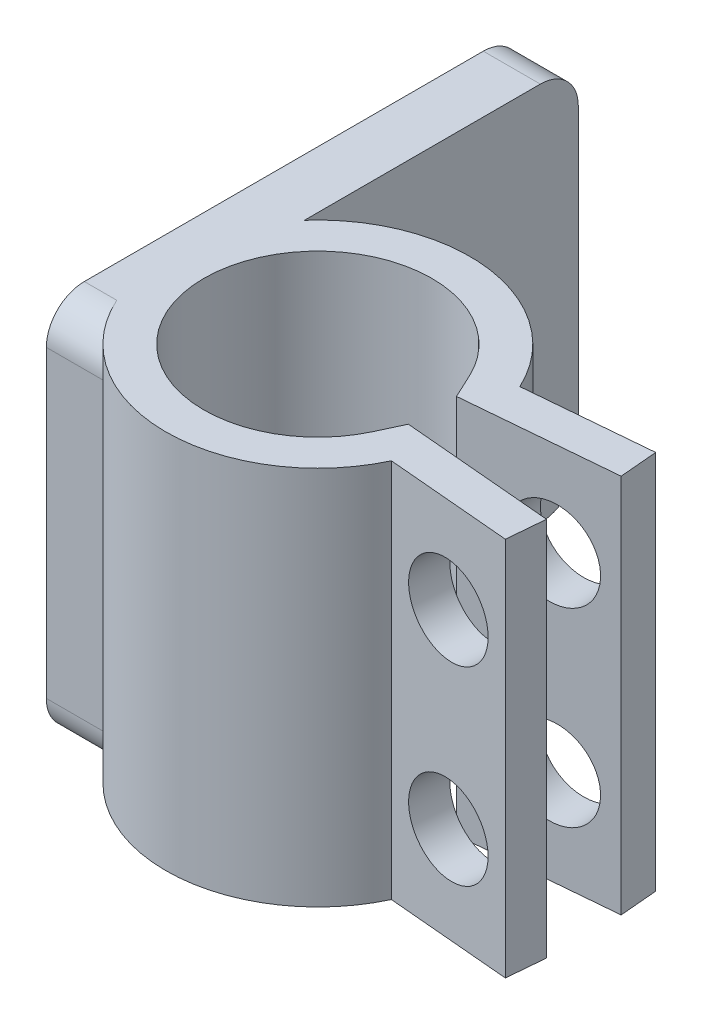
ISO-10303-21;
HEADER;
FILE_DESCRIPTION(('STEP AP214'),'2;1');
FILE_NAME('part.step','',(''),(''),'','','');
FILE_SCHEMA(('AUTOMOTIVE_DESIGN { 1 0 10303 214 1 1 1 1 }'));
ENDSEC;
DATA;
#1=APPLICATION_CONTEXT('core data for automotive mechanical design processes');
#2=APPLICATION_PROTOCOL_DEFINITION('international standard','automotive_design',2000,#1);
#3=PRODUCT_CONTEXT('',#1,'mechanical');
#4=PRODUCT('Part','Part','',(#3));
#5=PRODUCT_RELATED_PRODUCT_CATEGORY('part','',(#4));
#6=PRODUCT_DEFINITION_FORMATION('','',#4);
#7=PRODUCT_DEFINITION_CONTEXT('part definition',#1,'design');
#8=PRODUCT_DEFINITION('design','',#6,#7);
#9=PRODUCT_DEFINITION_SHAPE('','',#8);
#10=(LENGTH_UNIT() NAMED_UNIT(*) SI_UNIT(.MILLI.,.METRE.));
#11=(NAMED_UNIT(*) PLANE_ANGLE_UNIT() SI_UNIT($,.RADIAN.));
#12=(NAMED_UNIT(*) SI_UNIT($,.STERADIAN.) SOLID_ANGLE_UNIT());
#13=UNCERTAINTY_MEASURE_WITH_UNIT(LENGTH_MEASURE(1.E-05),#10,'distance_accuracy_value','');
#14=(GEOMETRIC_REPRESENTATION_CONTEXT(3) GLOBAL_UNCERTAINTY_ASSIGNED_CONTEXT((#13)) GLOBAL_UNIT_ASSIGNED_CONTEXT((#10,
#11,#12)) REPRESENTATION_CONTEXT('',''));
#15=CARTESIAN_POINT('',(0.,0.,0.));
#16=DIRECTION('',(0.,0.,1.));
#17=DIRECTION('',(1.,0.,0.));
#18=AXIS2_PLACEMENT_3D('',#15,#16,#17);
#19=CARTESIAN_POINT('',(3.81,25.4,0.));
#20=DIRECTION('',(0.,0.,-1.));
#21=DIRECTION('',(-1.,0.,0.));
#22=AXIS2_PLACEMENT_3D('',#19,#20,#21);
#23=PLANE('',#22);
#24=DIRECTION('',(0.,-1.,0.));
#25=VECTOR('',#24,1.);
#26=CARTESIAN_POINT('',(3.80999999999999,25.4,0.));
#27=LINE('',#26,#25);
#28=CARTESIAN_POINT('',(3.80999999999999,22.86,0.));
#29=VERTEX_POINT('',#28);
#30=CARTESIAN_POINT('',(3.80999999999999,2.54,0.));
#31=VERTEX_POINT('',#30);
#32=EDGE_CURVE('E200',#29,#31,#27,.T.);
#33=ORIENTED_EDGE('',*,*,#32,.F.);
#34=DIRECTION('',(1.,0.,0.));
#35=VECTOR('',#34,1.);
#36=CARTESIAN_POINT('',(3.81,22.86,0.));
#37=LINE('',#36,#35);
#38=CARTESIAN_POINT('',(0.,22.86,0.));
#39=VERTEX_POINT('',#38);
#40=EDGE_CURVE('E371',#29,#39,#37,.F.);
#41=ORIENTED_EDGE('',*,*,#40,.T.);
#42=DIRECTION('',(0.,-1.,0.));
#43=VECTOR('',#42,1.);
#44=CARTESIAN_POINT('',(0.,25.4,0.));
#45=LINE('',#44,#43);
#46=CARTESIAN_POINT('',(0.,2.54,0.));
#47=VERTEX_POINT('',#46);
#48=EDGE_CURVE('E243',#39,#47,#45,.T.);
#49=ORIENTED_EDGE('',*,*,#48,.T.);
#50=DIRECTION('',(1.,0.,0.));
#51=VECTOR('',#50,1.);
#52=CARTESIAN_POINT('',(3.80999999999999,2.54,0.));
#53=LINE('',#52,#51);
#54=EDGE_CURVE('E368',#47,#31,#53,.T.);
#55=ORIENTED_EDGE('',*,*,#54,.T.);
#56=EDGE_LOOP('',(#33,#41,#49,#55));
#57=FACE_BOUND('',#56,.T.);
#58=ADVANCED_FACE('F45',(#57),#23,.F.);
#59=CARTESIAN_POINT('',(11.43,25.4,-6.72020833010407));
#60=DIRECTION('',(0.,-1.,0.));
#61=DIRECTION('',(0.,0.,-1.));
#62=AXIS2_PLACEMENT_3D('',#59,#60,#61);
#63=CYLINDRICAL_SURFACE('',#62,10.16);
#64=CARTESIAN_POINT('',(11.43,0.,-6.72020833010407));
#65=DIRECTION('',(0.,1.,0.));
#66=DIRECTION('',(0.,0.,-1.));
#67=AXIS2_PLACEMENT_3D('',#64,#65,#66);
#68=CIRCLE('',#67,10.16);
#69=CARTESIAN_POINT('',(2.16979166989591,0.,-2.54));
#70=VERTEX_POINT('',#69);
#71=CARTESIAN_POINT('',(20.6380871162924,0.,-2.42640679081854));
#72=VERTEX_POINT('',#71);
#73=EDGE_CURVE('E66',#70,#72,#68,.T.);
#74=ORIENTED_EDGE('',*,*,#73,.T.);
#75=DIRECTION('',(0.,-1.,0.));
#76=VECTOR('',#75,1.);
#77=CARTESIAN_POINT('',(20.6380871162924,25.4,-2.42640679081854));
#78=LINE('',#77,#76);
#79=CARTESIAN_POINT('',(20.6380871162924,25.4,-2.42640679081854));
#80=VERTEX_POINT('',#79);
#81=EDGE_CURVE('E196',#80,#72,#78,.T.);
#82=ORIENTED_EDGE('',*,*,#81,.F.);
#83=CARTESIAN_POINT('',(11.43,25.4,-6.72020833010407));
#84=DIRECTION('',(0.,1.,0.));
#85=DIRECTION('',(0.,0.,-1.));
#86=AXIS2_PLACEMENT_3D('',#83,#84,#85);
#87=CIRCLE('',#86,10.16);
#88=CARTESIAN_POINT('',(2.16979166989591,25.4,-2.54));
#89=VERTEX_POINT('',#88);
#90=EDGE_CURVE('E180',#89,#80,#87,.T.);
#91=ORIENTED_EDGE('',*,*,#90,.F.);
#92=CARTESIAN_POINT('',(2.16979166989591,25.4,-2.54));
#93=CARTESIAN_POINT('',(2.20617578446925,25.4000022486676,-2.45937381307713));
#94=CARTESIAN_POINT('',(2.24362102791045,25.39616176463,-2.37925640768245));
#95=CARTESIAN_POINT('',(2.32027563615628,25.3810992971566,-2.22062843644151));
#96=CARTESIAN_POINT('',(2.35948395849282,25.3698816235803,-2.14211695998561));
#97=CARTESIAN_POINT('',(2.43922284391043,25.3404149766029,-1.98744109188222));
#98=CARTESIAN_POINT('',(2.47974880513843,25.3221884790528,-1.91127002969529));
#99=CARTESIAN_POINT('',(2.56186735924763,25.2790005467206,-1.76146535549955));
#100=CARTESIAN_POINT('',(2.6034601119886,25.2540380971501,-1.68783212770848));
#101=CARTESIAN_POINT('',(2.72906700992553,25.1695859814455,-1.47168505024253));
#102=CARTESIAN_POINT('',(2.81415714228701,25.100438463565,-1.33344794231537));
#103=CARTESIAN_POINT('',(2.98384054470034,24.9379336121309,-1.07109642517883));
#104=CARTESIAN_POINT('',(3.06843224509921,24.8445215889568,-0.947014842158039));
#105=CARTESIAN_POINT('',(3.19370014114968,24.6844263356683,-0.770875672298314));
#106=CARTESIAN_POINT('',(3.23621993407571,24.6260041784557,-0.712514926105099));
#107=CARTESIAN_POINT('',(3.31908837111386,24.5029120426174,-0.601095528766416));
#108=CARTESIAN_POINT('',(3.35943655513979,24.4382407480728,-0.548037999157822));
#109=CARTESIAN_POINT('',(3.4757110599449,24.2352989960347,-0.397965544116279));
#110=CARTESIAN_POINT('',(3.54723992219447,24.0876413639235,-0.309537276156607));
#111=CARTESIAN_POINT('',(3.64733112517624,23.8274669513059,-0.188784370342516));
#112=CARTESIAN_POINT('',(3.68210610695862,23.7213107872541,-0.147709658422272));
#113=CARTESIAN_POINT('',(3.74028760162198,23.5017117261741,-0.0797318652234852));
#114=CARTESIAN_POINT('',(3.76372533504968,23.3882898256055,-0.0527898477916273));
#115=CARTESIAN_POINT('',(3.79011263506569,23.2049960098705,-0.0226011391847973));
#116=CARTESIAN_POINT('',(3.7975279205162,23.1365700514542,-0.0141613715277852));
#117=CARTESIAN_POINT('',(3.80748887611146,22.9987814828586,-0.00284710306384829));
#118=CARTESIAN_POINT('',(3.81002535650179,22.9294173524163,1.6895304640736E-05));
#119=CARTESIAN_POINT('',(3.80999999999997,22.86,0.));
#120=B_SPLINE_CURVE_WITH_KNOTS('',3,(#92,#93,#94,#95,#96,#97,#98,#99,#100,#101,#102,#103,#104,
#105,#106,#107,#108,#109,#110,#111,#112,#113,#114,#115,#116,#117,#118,#119),.UNSPECIFIED.,.F.,
.F.,(4,2,2,2,2,2,2,2,2,2,2,2,2,4),(0.,0.265235178077459,0.530315539461783,0.794552837813953,
1.05882996643843,1.58577059684386,2.11390935939937,2.39219724894735,2.670543867508,
3.22492127293216,3.58070086763114,3.93549505749906,4.14315412551022,4.35120396014529),.UNSPECIFIED.);
#121=EDGE_CURVE('E59',#89,#29,#120,.T.);
#122=ORIENTED_EDGE('',*,*,#121,.T.);
#123=ORIENTED_EDGE('',*,*,#32,.T.);
#124=CARTESIAN_POINT('',(3.80999999999999,2.54,0.));
#125=CARTESIAN_POINT('',(3.81001944877823,2.47953872180205,1.45912342866978E-05));
#126=CARTESIAN_POINT('',(3.80809672355019,2.41909078166757,-0.00215825276973638));
#127=CARTESIAN_POINT('',(3.80051585879497,2.29878731189161,-0.0107649012316474));
#128=CARTESIAN_POINT('',(3.79486105454885,2.23893130168792,-0.0171949011744631));
#129=CARTESIAN_POINT('',(3.78003058297259,2.12079426141355,-0.0341268494232981));
#130=CARTESIAN_POINT('',(3.77088660941287,2.06250396789028,-0.0445921519081007));
#131=CARTESIAN_POINT('',(3.74933587454819,1.9473779122334,-0.0693986645282128));
#132=CARTESIAN_POINT('',(3.73692854199819,1.89054240667103,-0.0837405532650684));
#133=CARTESIAN_POINT('',(3.69535326468878,1.72315302604248,-0.132139732832964));
#134=CARTESIAN_POINT('',(3.66176421622409,1.61520883278615,-0.171646022371034));
#135=CARTESIAN_POINT('',(3.58542459748406,1.40814805402263,-0.263289991518458));
#136=CARTESIAN_POINT('',(3.54264981823027,1.30905579431727,-0.315461097559224));
#137=CARTESIAN_POINT('',(3.43288454202392,1.08469635860234,-0.452666275131953));
#138=CARTESIAN_POINT('',(3.36288823373286,0.963906239680729,-0.542638728252105));
#139=CARTESIAN_POINT('',(3.21580363904479,0.742168228790588,-0.739595264895516));
#140=CARTESIAN_POINT('',(3.1387062673135,0.641246289347291,-0.846601272773882));
#141=CARTESIAN_POINT('',(2.98054541131174,0.458795659041022,-1.07644811638925));
#142=CARTESIAN_POINT('',(2.89944272053735,0.377543847518989,-1.19948127203536));
#143=CARTESIAN_POINT('',(2.7377594895234,0.23742890417796,-1.45772453437343));
#144=CARTESIAN_POINT('',(2.65717839555736,0.178535941222118,-1.59291811645708));
#145=CARTESIAN_POINT('',(2.50623938680048,0.0887854917835852,-1.86082818487476));
#146=CARTESIAN_POINT('',(2.43560749693108,0.0559096808611599,-1.99270691167154));
#147=CARTESIAN_POINT('',(2.33310298418178,0.0226124715089665,-2.19496576323919));
#148=CARTESIAN_POINT('',(2.29947112023319,0.014182367344856,-2.26320852405464));
#149=CARTESIAN_POINT('',(2.23356266209511,0.00287570379854424,-2.40083592036335));
#150=CARTESIAN_POINT('',(2.20128669360069,1.68138951055278E-06,-2.47022106290563));
#151=CARTESIAN_POINT('',(2.16979166989591,0.,-2.54));
#152=B_SPLINE_CURVE_WITH_KNOTS('',3,(#124,#125,#126,#127,#128,#129,#130,#131,#132,#133,#134,
#135,#136,#137,#138,#139,#140,#141,#142,#143,#144,#145,#146,#147,#148,#149,#150,#151),
.UNSPECIFIED.,.F.,.F.,(4,2,2,2,2,2,2,2,2,2,2,2,2,4),(0.,0.181292603993164,0.362423409562659,
0.541946643901701,0.721501324395022,1.07907849454729,1.43760988491519,1.93321554558637,
2.42946435012614,2.93233791696081,3.43453817299674,3.89233791589334,4.12177898291297,
4.35132479073711),.UNSPECIFIED.);
#153=EDGE_CURVE('E11',#31,#70,#152,.T.);
#154=ORIENTED_EDGE('',*,*,#153,.T.);
#155=EDGE_LOOP('',(#74,#82,#91,#122,#123,#154));
#156=FACE_BOUND('',#155,.T.);
#157=ADVANCED_FACE('F197',(#156),#63,.T.);
#158=CARTESIAN_POINT('',(28.9876659345984,25.4,-1.69591329900057));
#159=DIRECTION('',(0.0871557427476594,0.,-0.996194698091745));
#160=DIRECTION('',(-0.996194698091745,0.,-0.0871557427476594));
#161=AXIS2_PLACEMENT_3D('',#158,#159,#160);
#162=PLANE('',#161);
#163=CARTESIAN_POINT('',(24.8128765254454,19.05,-2.06116004490956));
#164=DIRECTION('',(-0.0871557427476594,0.,0.996194698091746));
#165=DIRECTION('',(0.996194698091746,0.,0.0871557427476594));
#166=AXIS2_PLACEMENT_3D('',#163,#164,#165);
#167=CIRCLE('',#166,2.921);
#168=CARTESIAN_POINT('',(27.7227612385714,19.05,-1.80657812034365));
#169=VERTEX_POINT('',#168);
#170=EDGE_CURVE('E536',#169,#169,#167,.T.);
#171=ORIENTED_EDGE('',*,*,#170,.F.);
#172=EDGE_LOOP('',(#171));
#173=FACE_BOUND('',#172,.T.);
#174=CARTESIAN_POINT('',(24.8128765254454,6.35,-2.06116004490956));
#175=DIRECTION('',(-0.0871557427476594,0.,0.996194698091746));
#176=DIRECTION('',(0.996194698091746,0.,0.0871557427476594));
#177=AXIS2_PLACEMENT_3D('',#174,#175,#176);
#178=CIRCLE('',#177,2.921);
#179=CARTESIAN_POINT('',(27.7227612385714,6.35,-1.80657812034365));
#180=VERTEX_POINT('',#179);
#181=EDGE_CURVE('E548',#180,#180,#178,.T.);
#182=ORIENTED_EDGE('',*,*,#181,.F.);
#183=EDGE_LOOP('',(#182));
#184=FACE_BOUND('',#183,.T.);
#185=DIRECTION('',(0.996194698091745,0.,0.0871557427476594));
#186=VECTOR('',#185,1.);
#187=CARTESIAN_POINT('',(28.9876659345984,0.,-1.69591329900057));
#188=LINE('',#187,#186);
#189=CARTESIAN_POINT('',(28.9876659345984,0.,-1.69591329900057));
#190=VERTEX_POINT('',#189);
#191=EDGE_CURVE('E246',#72,#190,#188,.T.);
#192=ORIENTED_EDGE('',*,*,#191,.T.);
#193=DIRECTION('',(0.,-1.,0.));
#194=VECTOR('',#193,1.);
#195=CARTESIAN_POINT('',(28.9876659345984,25.4,-1.69591329900057));
#196=LINE('',#195,#194);
#197=CARTESIAN_POINT('',(28.9876659345984,25.4,-1.69591329900057));
#198=VERTEX_POINT('',#197);
#199=EDGE_CURVE('E201',#198,#190,#196,.T.);
#200=ORIENTED_EDGE('',*,*,#199,.F.);
#201=DIRECTION('',(0.996194698091745,0.,0.0871557427476594));
#202=VECTOR('',#201,1.);
#203=CARTESIAN_POINT('',(28.9876659345984,25.4,-1.69591329900057));
#204=LINE('',#203,#202);
#205=EDGE_CURVE('E185',#80,#198,#204,.T.);
#206=ORIENTED_EDGE('',*,*,#205,.F.);
#207=ORIENTED_EDGE('',*,*,#81,.T.);
#208=EDGE_LOOP('',(#192,#200,#206,#207));
#209=FACE_BOUND('',#208,.T.);
#210=ADVANCED_FACE('F203',(#173,#184,#209),#162,.F.);
#211=CARTESIAN_POINT('',(29.2090415211774,25.4,-4.22624783215361));
#212=DIRECTION('',(-0.996194698091745,0.,-0.0871557427476597));
#213=DIRECTION('',(-0.0871557427476597,0.,0.996194698091745));
#214=AXIS2_PLACEMENT_3D('',#211,#212,#213);
#215=PLANE('',#214);
#216=DIRECTION('',(0.0871557427476596,0.,-0.996194698091745));
#217=VECTOR('',#216,1.);
#218=CARTESIAN_POINT('',(29.2090415211774,0.,-4.22624783215361));
#219=LINE('',#218,#217);
#220=CARTESIAN_POINT('',(29.2090415211774,0.,-4.22624783215361));
#221=VERTEX_POINT('',#220);
#222=EDGE_CURVE('E250',#190,#221,#219,.T.);
#223=ORIENTED_EDGE('',*,*,#222,.T.);
#224=DIRECTION('',(0.,-1.,0.));
#225=VECTOR('',#224,1.);
#226=CARTESIAN_POINT('',(29.2090415211774,25.4,-4.22624783215361));
#227=LINE('',#226,#225);
#228=CARTESIAN_POINT('',(29.2090415211774,25.4,-4.22624783215361));
#229=VERTEX_POINT('',#228);
#230=EDGE_CURVE('E328',#229,#221,#227,.T.);
#231=ORIENTED_EDGE('',*,*,#230,.F.);
#232=DIRECTION('',(0.0871557427476596,0.,-0.996194698091745));
#233=VECTOR('',#232,1.);
#234=CARTESIAN_POINT('',(29.2090415211774,25.4,-4.22624783215361));
#235=LINE('',#234,#233);
#236=EDGE_CURVE('E207',#198,#229,#235,.T.);
#237=ORIENTED_EDGE('',*,*,#236,.F.);
#238=ORIENTED_EDGE('',*,*,#199,.T.);
#239=EDGE_LOOP('',(#223,#231,#237,#238));
#240=FACE_BOUND('',#239,.T.);
#241=ADVANCED_FACE('F475',(#240),#215,.F.);
#242=CARTESIAN_POINT('',(19.0877033885653,25.4,-5.11175017846983));
#243=DIRECTION('',(-0.0871557427476601,0.,0.996194698091745));
#244=DIRECTION('',(0.996194698091745,0.,0.0871557427476601));
#245=AXIS2_PLACEMENT_3D('',#242,#243,#244);
#246=PLANE('',#245);
#247=CARTESIAN_POINT('',(25.0342521120244,19.05,-4.5914945780626));
#248=DIRECTION('',(-0.0871557427476601,0.,0.996194698091745));
#249=DIRECTION('',(0.996194698091745,0.,0.0871557427476601));
#250=AXIS2_PLACEMENT_3D('',#247,#248,#249);
#251=CIRCLE('',#250,2.921);
#252=CARTESIAN_POINT('',(27.9441368251504,19.05,-4.33691265349668));
#253=VERTEX_POINT('',#252);
#254=EDGE_CURVE('E539',#253,#253,#251,.F.);
#255=ORIENTED_EDGE('',*,*,#254,.F.);
#256=EDGE_LOOP('',(#255));
#257=FACE_BOUND('',#256,.T.);
#258=CARTESIAN_POINT('',(25.0342521120244,6.35,-4.5914945780626));
#259=DIRECTION('',(-0.0871557427476601,0.,0.996194698091745));
#260=DIRECTION('',(0.996194698091745,0.,0.0871557427476601));
#261=AXIS2_PLACEMENT_3D('',#258,#259,#260);
#262=CIRCLE('',#261,2.921);
#263=CARTESIAN_POINT('',(27.9441368251504,6.35,-4.33691265349668));
#264=VERTEX_POINT('',#263);
#265=EDGE_CURVE('E554',#264,#264,#262,.F.);
#266=ORIENTED_EDGE('',*,*,#265,.F.);
#267=EDGE_LOOP('',(#266));
#268=FACE_BOUND('',#267,.T.);
#269=DIRECTION('',(-0.996194698091745,0.,-0.0871557427476601));
#270=VECTOR('',#269,1.);
#271=CARTESIAN_POINT('',(19.0877033885653,0.,-5.11175017846983));
#272=LINE('',#271,#270);
#273=CARTESIAN_POINT('',(19.0877033885653,0.,-5.11175017846983));
#274=VERTEX_POINT('',#273);
#275=EDGE_CURVE('E253',#221,#274,#272,.T.);
#276=ORIENTED_EDGE('',*,*,#275,.T.);
#277=DIRECTION('',(0.,-1.,0.));
#278=VECTOR('',#277,1.);
#279=CARTESIAN_POINT('',(19.0877033885653,25.4,-5.11175017846983));
#280=LINE('',#279,#278);
#281=CARTESIAN_POINT('',(19.0877033885653,25.4,-5.11175017846983));
#282=VERTEX_POINT('',#281);
#283=EDGE_CURVE('E324',#282,#274,#280,.T.);
#284=ORIENTED_EDGE('',*,*,#283,.F.);
#285=DIRECTION('',(-0.996194698091745,0.,-0.0871557427476601));
#286=VECTOR('',#285,1.);
#287=CARTESIAN_POINT('',(19.0877033885653,25.4,-5.11175017846983));
#288=LINE('',#287,#286);
#289=EDGE_CURVE('E210',#229,#282,#288,.T.);
#290=ORIENTED_EDGE('',*,*,#289,.F.);
#291=ORIENTED_EDGE('',*,*,#230,.T.);
#292=EDGE_LOOP('',(#276,#284,#290,#291));
#293=FACE_BOUND('',#292,.T.);
#294=ADVANCED_FACE('F471',(#257,#268,#293),#246,.F.);
#295=CARTESIAN_POINT('',(18.3360653372192,25.4,-3.49985717563994));
#296=DIRECTION('',(0.906307787036651,0.,0.422618261740698));
#297=DIRECTION('',(0.422618261740698,0.,-0.906307787036651));
#298=AXIS2_PLACEMENT_3D('',#295,#296,#297);
#299=PLANE('',#298);
#300=DIRECTION('',(-0.422618261740698,0.,0.906307787036651));
#301=VECTOR('',#300,1.);
#302=CARTESIAN_POINT('',(18.3360653372192,0.,-3.49985717563994));
#303=LINE('',#302,#301);
#304=CARTESIAN_POINT('',(18.3360653372192,0.,-3.49985717563994));
#305=VERTEX_POINT('',#304);
#306=EDGE_CURVE('E256',#274,#305,#303,.T.);
#307=ORIENTED_EDGE('',*,*,#306,.T.);
#308=DIRECTION('',(0.,-1.,0.));
#309=VECTOR('',#308,1.);
#310=CARTESIAN_POINT('',(18.3360653372192,25.4,-3.49985717563994));
#311=LINE('',#310,#309);
#312=CARTESIAN_POINT('',(18.3360653372192,25.4,-3.49985717563994));
#313=VERTEX_POINT('',#312);
#314=EDGE_CURVE('E320',#313,#305,#311,.T.);
#315=ORIENTED_EDGE('',*,*,#314,.F.);
#316=DIRECTION('',(-0.422618261740698,0.,0.906307787036651));
#317=VECTOR('',#316,1.);
#318=CARTESIAN_POINT('',(18.3360653372192,25.4,-3.49985717563994));
#319=LINE('',#318,#317);
#320=EDGE_CURVE('E216',#282,#313,#319,.T.);
#321=ORIENTED_EDGE('',*,*,#320,.F.);
#322=ORIENTED_EDGE('',*,*,#283,.T.);
#323=EDGE_LOOP('',(#307,#315,#321,#322));
#324=FACE_BOUND('',#323,.T.);
#325=ADVANCED_FACE('F466',(#324),#299,.F.);
#326=CARTESIAN_POINT('',(11.43,25.4,-6.72020833010407));
#327=DIRECTION('',(0.,-1.,0.));
#328=DIRECTION('',(0.,0.,-1.));
#329=AXIS2_PLACEMENT_3D('',#326,#327,#328);
#330=CYLINDRICAL_SURFACE('',#329,7.62);
#331=CARTESIAN_POINT('',(11.43,0.,-6.72020833010407));
#332=DIRECTION('',(0.,-1.,0.));
#333=DIRECTION('',(0.,0.,-1.));
#334=AXIS2_PLACEMENT_3D('',#331,#332,#333);
#335=CIRCLE('',#334,7.62);
#336=CARTESIAN_POINT('',(18.3360653372193,0.,-9.9405594845682));
#337=VERTEX_POINT('',#336);
#338=EDGE_CURVE('E260',#305,#337,#335,.T.);
#339=ORIENTED_EDGE('',*,*,#338,.T.);
#340=DIRECTION('',(0.,-1.,0.));
#341=VECTOR('',#340,1.);
#342=CARTESIAN_POINT('',(18.3360653372193,25.4,-9.9405594845682));
#343=LINE('',#342,#341);
#344=CARTESIAN_POINT('',(18.3360653372193,25.4,-9.9405594845682));
#345=VERTEX_POINT('',#344);
#346=EDGE_CURVE('E316',#345,#337,#343,.T.);
#347=ORIENTED_EDGE('',*,*,#346,.F.);
#348=CARTESIAN_POINT('',(11.43,25.4,-6.72020833010407));
#349=DIRECTION('',(0.,-1.,0.));
#350=DIRECTION('',(0.,0.,-1.));
#351=AXIS2_PLACEMENT_3D('',#348,#349,#350);
#352=CIRCLE('',#351,7.61999999999999);
#353=EDGE_CURVE('E219',#313,#345,#352,.T.);
#354=ORIENTED_EDGE('',*,*,#353,.F.);
#355=ORIENTED_EDGE('',*,*,#314,.T.);
#356=EDGE_LOOP('',(#339,#347,#354,#355));
#357=FACE_BOUND('',#356,.T.);
#358=ADVANCED_FACE('F462',(#357),#330,.F.);
#359=CARTESIAN_POINT('',(18.3360653372193,25.4,-9.9405594845682));
#360=DIRECTION('',(0.90630778703665,0.,-0.4226182617407));
#361=DIRECTION('',(-0.4226182617407,0.,-0.90630778703665));
#362=AXIS2_PLACEMENT_3D('',#359,#360,#361);
#363=PLANE('',#362);
#364=DIRECTION('',(0.4226182617407,0.,0.90630778703665));
#365=VECTOR('',#364,1.);
#366=CARTESIAN_POINT('',(18.3360653372193,0.,-9.9405594845682));
#367=LINE('',#366,#365);
#368=CARTESIAN_POINT('',(19.0877033885653,0.,-8.3286664817383));
#369=VERTEX_POINT('',#368);
#370=EDGE_CURVE('E263',#337,#369,#367,.T.);
#371=ORIENTED_EDGE('',*,*,#370,.T.);
#372=DIRECTION('',(0.,-1.,0.));
#373=VECTOR('',#372,1.);
#374=CARTESIAN_POINT('',(19.0877033885653,25.4,-8.3286664817383));
#375=LINE('',#374,#373);
#376=CARTESIAN_POINT('',(19.0877033885653,25.4,-8.3286664817383));
#377=VERTEX_POINT('',#376);
#378=EDGE_CURVE('E312',#377,#369,#375,.T.);
#379=ORIENTED_EDGE('',*,*,#378,.F.);
#380=DIRECTION('',(0.4226182617407,0.,0.90630778703665));
#381=VECTOR('',#380,1.);
#382=CARTESIAN_POINT('',(18.3360653372193,25.4,-9.9405594845682));
#383=LINE('',#382,#381);
#384=EDGE_CURVE('E222',#345,#377,#383,.T.);
#385=ORIENTED_EDGE('',*,*,#384,.F.);
#386=ORIENTED_EDGE('',*,*,#346,.T.);
#387=EDGE_LOOP('',(#371,#379,#385,#386));
#388=FACE_BOUND('',#387,.T.);
#389=ADVANCED_FACE('F457',(#388),#363,.F.);
#390=CARTESIAN_POINT('',(19.0877033885653,25.4,-8.3286664817383));
#391=DIRECTION('',(-0.087155742747663,0.,-0.996194698091745));
#392=DIRECTION('',(-0.996194698091745,0.,0.087155742747663));
#393=AXIS2_PLACEMENT_3D('',#390,#391,#392);
#394=PLANE('',#393);
#395=CARTESIAN_POINT('',(25.0342521120244,19.05,-8.84892208214556));
#396=DIRECTION('',(-0.087155742747663,0.,-0.996194698091745));
#397=DIRECTION('',(-0.996194698091745,0.,0.087155742747663));
#398=AXIS2_PLACEMENT_3D('',#395,#396,#397);
#399=CIRCLE('',#398,2.921);
#400=CARTESIAN_POINT('',(22.1243673988984,19.05,-8.59434015757964));
#401=VERTEX_POINT('',#400);
#402=EDGE_CURVE('E558',#401,#401,#399,.F.);
#403=ORIENTED_EDGE('',*,*,#402,.F.);
#404=EDGE_LOOP('',(#403));
#405=FACE_BOUND('',#404,.T.);
#406=CARTESIAN_POINT('',(25.0342521120244,6.35,-8.84892208214556));
#407=DIRECTION('',(-0.087155742747663,0.,-0.996194698091745));
#408=DIRECTION('',(-0.996194698091745,0.,0.087155742747663));
#409=AXIS2_PLACEMENT_3D('',#406,#407,#408);
#410=CIRCLE('',#409,2.921);
#411=CARTESIAN_POINT('',(22.1243673988984,6.35,-8.59434015757964));
#412=VERTEX_POINT('',#411);
#413=EDGE_CURVE('E546',#412,#412,#410,.F.);
#414=ORIENTED_EDGE('',*,*,#413,.F.);
#415=EDGE_LOOP('',(#414));
#416=FACE_BOUND('',#415,.T.);
#417=DIRECTION('',(0.996194698091745,0.,-0.087155742747663));
#418=VECTOR('',#417,1.);
#419=CARTESIAN_POINT('',(19.0877033885653,0.,-8.3286664817383));
#420=LINE('',#419,#418);
#421=CARTESIAN_POINT('',(29.2090415211774,0.,-9.21416882805456));
#422=VERTEX_POINT('',#421);
#423=EDGE_CURVE('E266',#369,#422,#420,.T.);
#424=ORIENTED_EDGE('',*,*,#423,.T.);
#425=DIRECTION('',(0.,-1.,0.));
#426=VECTOR('',#425,1.);
#427=CARTESIAN_POINT('',(29.2090415211774,25.4,-9.21416882805456));
#428=LINE('',#427,#426);
#429=CARTESIAN_POINT('',(29.2090415211774,25.4,-9.21416882805456));
#430=VERTEX_POINT('',#429);
#431=EDGE_CURVE('E308',#430,#422,#428,.T.);
#432=ORIENTED_EDGE('',*,*,#431,.F.);
#433=DIRECTION('',(0.996194698091745,0.,-0.087155742747663));
#434=VECTOR('',#433,1.);
#435=CARTESIAN_POINT('',(19.0877033885653,25.4,-8.3286664817383));
#436=LINE('',#435,#434);
#437=EDGE_CURVE('E225',#377,#430,#436,.T.);
#438=ORIENTED_EDGE('',*,*,#437,.F.);
#439=ORIENTED_EDGE('',*,*,#378,.T.);
#440=EDGE_LOOP('',(#424,#432,#438,#439));
#441=FACE_BOUND('',#440,.T.);
#442=ADVANCED_FACE('F452',(#405,#416,#441),#394,.F.);
#443=CARTESIAN_POINT('',(29.2090415211774,25.4,-9.21416882805456));
#444=DIRECTION('',(-0.996194698091745,0.,0.0871557427476623));
#445=DIRECTION('',(0.0871557427476623,0.,0.996194698091745));
#446=AXIS2_PLACEMENT_3D('',#443,#444,#445);
#447=PLANE('',#446);
#448=DIRECTION('',(-0.0871557427476623,0.,-0.996194698091745));
#449=VECTOR('',#448,1.);
#450=CARTESIAN_POINT('',(29.2090415211774,0.,-9.21416882805456));
#451=LINE('',#450,#449);
#452=CARTESIAN_POINT('',(28.9876659345984,0.,-11.7445033612076));
#453=VERTEX_POINT('',#452);
#454=EDGE_CURVE('E269',#422,#453,#451,.T.);
#455=ORIENTED_EDGE('',*,*,#454,.T.);
#456=DIRECTION('',(0.,-1.,0.));
#457=VECTOR('',#456,1.);
#458=CARTESIAN_POINT('',(28.9876659345984,25.4,-11.7445033612076));
#459=LINE('',#458,#457);
#460=CARTESIAN_POINT('',(28.9876659345984,25.4,-11.7445033612076));
#461=VERTEX_POINT('',#460);
#462=EDGE_CURVE('E304',#461,#453,#459,.T.);
#463=ORIENTED_EDGE('',*,*,#462,.F.);
#464=DIRECTION('',(-0.0871557427476623,0.,-0.996194698091745));
#465=VECTOR('',#464,1.);
#466=CARTESIAN_POINT('',(29.2090415211774,25.4,-9.21416882805456));
#467=LINE('',#466,#465);
#468=EDGE_CURVE('E228',#430,#461,#467,.T.);
#469=ORIENTED_EDGE('',*,*,#468,.F.);
#470=ORIENTED_EDGE('',*,*,#431,.T.);
#471=EDGE_LOOP('',(#455,#463,#469,#470));
#472=FACE_BOUND('',#471,.T.);
#473=ADVANCED_FACE('F448',(#472),#447,.F.);
#474=CARTESIAN_POINT('',(28.9876659345984,25.4,-11.7445033612076));
#475=DIRECTION('',(0.0871557427476638,0.,0.996194698091745));
#476=DIRECTION('',(0.996194698091745,0.,-0.0871557427476638));
#477=AXIS2_PLACEMENT_3D('',#474,#475,#476);
#478=PLANE('',#477);
#479=CARTESIAN_POINT('',(24.8128765254454,19.05,-11.3792566152986));
#480=DIRECTION('',(-0.0871557427476638,0.,-0.996194698091745));
#481=DIRECTION('',(-0.996194698091745,0.,0.0871557427476638));
#482=AXIS2_PLACEMENT_3D('',#479,#480,#481);
#483=CIRCLE('',#482,2.921);
#484=CARTESIAN_POINT('',(21.9029918123194,19.05,-11.1246746907327));
#485=VERTEX_POINT('',#484);
#486=EDGE_CURVE('E562',#485,#485,#483,.T.);
#487=ORIENTED_EDGE('',*,*,#486,.F.);
#488=EDGE_LOOP('',(#487));
#489=FACE_BOUND('',#488,.T.);
#490=CARTESIAN_POINT('',(24.8128765254454,6.35,-11.3792566152986));
#491=DIRECTION('',(-0.0871557427476638,0.,-0.996194698091745));
#492=DIRECTION('',(-0.996194698091745,0.,0.0871557427476638));
#493=AXIS2_PLACEMENT_3D('',#490,#491,#492);
#494=CIRCLE('',#493,2.921);
#495=CARTESIAN_POINT('',(21.9029918123194,6.35,-11.1246746907327));
#496=VERTEX_POINT('',#495);
#497=EDGE_CURVE('E541',#496,#496,#494,.T.);
#498=ORIENTED_EDGE('',*,*,#497,.F.);
#499=EDGE_LOOP('',(#498));
#500=FACE_BOUND('',#499,.T.);
#501=DIRECTION('',(-0.996194698091745,0.,0.0871557427476638));
#502=VECTOR('',#501,1.);
#503=CARTESIAN_POINT('',(28.9876659345984,0.,-11.7445033612076));
#504=LINE('',#503,#502);
#505=CARTESIAN_POINT('',(20.6380871162923,0.,-11.0140098693896));
#506=VERTEX_POINT('',#505);
#507=EDGE_CURVE('E272',#453,#506,#504,.T.);
#508=ORIENTED_EDGE('',*,*,#507,.T.);
#509=DIRECTION('',(0.,-1.,0.));
#510=VECTOR('',#509,1.);
#511=CARTESIAN_POINT('',(20.6380871162923,25.4,-11.0140098693896));
#512=LINE('',#511,#510);
#513=CARTESIAN_POINT('',(20.6380871162923,25.4,-11.0140098693896));
#514=VERTEX_POINT('',#513);
#515=EDGE_CURVE('E300',#514,#506,#512,.T.);
#516=ORIENTED_EDGE('',*,*,#515,.F.);
#517=DIRECTION('',(-0.996194698091745,0.,0.0871557427476638));
#518=VECTOR('',#517,1.);
#519=CARTESIAN_POINT('',(28.9876659345984,25.4,-11.7445033612076));
#520=LINE('',#519,#518);
#521=EDGE_CURVE('E231',#461,#514,#520,.T.);
#522=ORIENTED_EDGE('',*,*,#521,.F.);
#523=ORIENTED_EDGE('',*,*,#462,.T.);
#524=EDGE_LOOP('',(#508,#516,#522,#523));
#525=FACE_BOUND('',#524,.T.);
#526=ADVANCED_FACE('F443',(#489,#500,#525),#478,.F.);
#527=CARTESIAN_POINT('',(11.43,25.4,-6.72020833010407));
#528=DIRECTION('',(0.,-1.,0.));
#529=DIRECTION('',(0.,0.,-1.));
#530=AXIS2_PLACEMENT_3D('',#527,#528,#529);
#531=CYLINDRICAL_SURFACE('',#530,10.16);
#532=CARTESIAN_POINT('',(11.43,0.,-6.72020833010407));
#533=DIRECTION('',(0.,1.,0.));
#534=DIRECTION('',(0.,0.,-1.));
#535=AXIS2_PLACEMENT_3D('',#532,#533,#534);
#536=CIRCLE('',#535,10.16);
#537=CARTESIAN_POINT('',(3.80999999999999,0.,-13.4404166602081));
#538=VERTEX_POINT('',#537);
#539=EDGE_CURVE('E275',#506,#538,#536,.T.);
#540=ORIENTED_EDGE('',*,*,#539,.T.);
#541=DIRECTION('',(0.,-1.,0.));
#542=VECTOR('',#541,1.);
#543=CARTESIAN_POINT('',(3.80999999999999,25.4,-13.4404166602081));
#544=LINE('',#543,#542);
#545=CARTESIAN_POINT('',(3.80999999999999,25.4,-13.4404166602081));
#546=VERTEX_POINT('',#545);
#547=EDGE_CURVE('E296',#546,#538,#544,.T.);
#548=ORIENTED_EDGE('',*,*,#547,.F.);
#549=CARTESIAN_POINT('',(11.43,25.4,-6.72020833010407));
#550=DIRECTION('',(0.,1.,0.));
#551=DIRECTION('',(0.,0.,-1.));
#552=AXIS2_PLACEMENT_3D('',#549,#550,#551);
#553=CIRCLE('',#552,10.16);
#554=EDGE_CURVE('E234',#514,#546,#553,.T.);
#555=ORIENTED_EDGE('',*,*,#554,.F.);
#556=ORIENTED_EDGE('',*,*,#515,.T.);
#557=EDGE_LOOP('',(#540,#548,#555,#556));
#558=FACE_BOUND('',#557,.T.);
#559=ADVANCED_FACE('F437',(#558),#531,.T.);
#560=CARTESIAN_POINT('',(3.80999999999999,25.4,-13.4404166602081));
#561=DIRECTION('',(-1.,0.,0.));
#562=DIRECTION('',(0.,0.,1.));
#563=AXIS2_PLACEMENT_3D('',#560,#561,#562);
#564=PLANE('',#563);
#565=CARTESIAN_POINT('',(3.80999999999999,12.7,-21.59));
#566=DIRECTION('',(-1.,0.,0.));
#567=DIRECTION('',(0.,0.,1.));
#568=AXIS2_PLACEMENT_3D('',#565,#566,#567);
#569=CIRCLE('',#568,3.175);
#570=CARTESIAN_POINT('',(3.80999999999999,12.7,-18.415));
#571=VERTEX_POINT('',#570);
#572=EDGE_CURVE('E247',#571,#571,#569,.F.);
#573=ORIENTED_EDGE('',*,*,#572,.F.);
#574=EDGE_LOOP('',(#573));
#575=FACE_BOUND('',#574,.T.);
#576=DIRECTION('',(0.,-1.,0.));
#577=VECTOR('',#576,1.);
#578=CARTESIAN_POINT('',(3.81,25.4,-31.75));
#579=LINE('',#578,#577);
#580=CARTESIAN_POINT('',(3.81,22.86,-31.75));
#581=VERTEX_POINT('',#580);
#582=CARTESIAN_POINT('',(3.81,2.54,-31.75));
#583=VERTEX_POINT('',#582);
#584=EDGE_CURVE('E292',#581,#583,#579,.T.);
#585=ORIENTED_EDGE('',*,*,#584,.F.);
#586=CARTESIAN_POINT('',(3.81,22.86,-29.21));
#587=DIRECTION('',(-1.,0.,0.));
#588=DIRECTION('',(0.,0.,1.));
#589=AXIS2_PLACEMENT_3D('',#586,#587,#588);
#590=CIRCLE('',#589,2.54);
#591=CARTESIAN_POINT('',(3.81,25.4,-29.21));
#592=VERTEX_POINT('',#591);
#593=EDGE_CURVE('E365',#581,#592,#590,.F.);
#594=ORIENTED_EDGE('',*,*,#593,.T.);
#595=DIRECTION('',(0.,0.,-1.));
#596=VECTOR('',#595,1.);
#597=CARTESIAN_POINT('',(3.80999999999999,25.4,-13.4404166602081));
#598=LINE('',#597,#596);
#599=EDGE_CURVE('E237',#546,#592,#598,.T.);
#600=ORIENTED_EDGE('',*,*,#599,.F.);
#601=ORIENTED_EDGE('',*,*,#547,.T.);
#602=DIRECTION('',(0.,0.,-1.));
#603=VECTOR('',#602,1.);
#604=CARTESIAN_POINT('',(3.80999999999999,0.,-13.4404166602081));
#605=LINE('',#604,#603);
#606=CARTESIAN_POINT('',(3.81,0.,-29.21));
#607=VERTEX_POINT('',#606);
#608=EDGE_CURVE('E278',#538,#607,#605,.T.);
#609=ORIENTED_EDGE('',*,*,#608,.T.);
#610=CARTESIAN_POINT('',(3.81,2.54,-29.21));
#611=DIRECTION('',(-1.,0.,0.));
#612=DIRECTION('',(0.,0.,1.));
#613=AXIS2_PLACEMENT_3D('',#610,#611,#612);
#614=CIRCLE('',#613,2.54);
#615=EDGE_CURVE('E362',#607,#583,#614,.F.);
#616=ORIENTED_EDGE('',*,*,#615,.T.);
#617=EDGE_LOOP('',(#585,#594,#600,#601,#609,#616));
#618=FACE_BOUND('',#617,.T.);
#619=ADVANCED_FACE('F433',(#575,#618),#564,.F.);
#620=CARTESIAN_POINT('',(0.,25.4,-31.75));
#621=DIRECTION('',(0.,0.,1.));
#622=DIRECTION('',(1.,0.,0.));
#623=AXIS2_PLACEMENT_3D('',#620,#621,#622);
#624=PLANE('',#623);
#625=DIRECTION('',(0.,-1.,0.));
#626=VECTOR('',#625,1.);
#627=CARTESIAN_POINT('',(0.,25.4,-31.75));
#628=LINE('',#627,#626);
#629=CARTESIAN_POINT('',(0.,22.86,-31.75));
#630=VERTEX_POINT('',#629);
#631=CARTESIAN_POINT('',(0.,2.54,-31.75));
#632=VERTEX_POINT('',#631);
#633=EDGE_CURVE('E288',#630,#632,#628,.T.);
#634=ORIENTED_EDGE('',*,*,#633,.F.);
#635=DIRECTION('',(-1.,0.,0.));
#636=VECTOR('',#635,1.);
#637=CARTESIAN_POINT('',(0.,22.86,-31.75));
#638=LINE('',#637,#636);
#639=EDGE_CURVE('E359',#630,#581,#638,.F.);
#640=ORIENTED_EDGE('',*,*,#639,.T.);
#641=ORIENTED_EDGE('',*,*,#584,.T.);
#642=DIRECTION('',(-1.,0.,0.));
#643=VECTOR('',#642,1.);
#644=CARTESIAN_POINT('',(0.,2.54,-31.75));
#645=LINE('',#644,#643);
#646=EDGE_CURVE('E355',#583,#632,#645,.T.);
#647=ORIENTED_EDGE('',*,*,#646,.T.);
#648=EDGE_LOOP('',(#634,#640,#641,#647));
#649=FACE_BOUND('',#648,.T.);
#650=ADVANCED_FACE('F423',(#649),#624,.F.);
#651=CARTESIAN_POINT('',(0.,25.4,0.));
#652=DIRECTION('',(1.,0.,0.));
#653=DIRECTION('',(0.,0.,-1.));
#654=AXIS2_PLACEMENT_3D('',#651,#652,#653);
#655=PLANE('',#654);
#656=CARTESIAN_POINT('',(0.,12.7,-21.59));
#657=DIRECTION('',(-1.,0.,0.));
#658=DIRECTION('',(0.,0.,1.));
#659=AXIS2_PLACEMENT_3D('',#656,#657,#658);
#660=CIRCLE('',#659,3.175);
#661=CARTESIAN_POINT('',(0.,12.7,-18.415));
#662=VERTEX_POINT('',#661);
#663=EDGE_CURVE('E565',#662,#662,#660,.T.);
#664=ORIENTED_EDGE('',*,*,#663,.F.);
#665=EDGE_LOOP('',(#664));
#666=FACE_BOUND('',#665,.T.);
#667=DIRECTION('',(0.,0.,1.));
#668=VECTOR('',#667,1.);
#669=CARTESIAN_POINT('',(0.,25.4,0.));
#670=LINE('',#669,#668);
#671=CARTESIAN_POINT('',(0.,25.4,-29.21));
#672=VERTEX_POINT('',#671);
#673=CARTESIAN_POINT('',(0.,25.4,-2.54));
#674=VERTEX_POINT('',#673);
#675=EDGE_CURVE('E240',#672,#674,#670,.T.);
#676=ORIENTED_EDGE('',*,*,#675,.F.);
#677=CARTESIAN_POINT('',(0.,22.86,-29.21));
#678=DIRECTION('',(1.,0.,0.));
#679=DIRECTION('',(0.,0.,-1.));
#680=AXIS2_PLACEMENT_3D('',#677,#678,#679);
#681=CIRCLE('',#680,2.54);
#682=EDGE_CURVE('E352',#672,#630,#681,.F.);
#683=ORIENTED_EDGE('',*,*,#682,.T.);
#684=ORIENTED_EDGE('',*,*,#633,.T.);
#685=CARTESIAN_POINT('',(0.,2.54,-29.21));
#686=DIRECTION('',(1.,0.,0.));
#687=DIRECTION('',(0.,0.,-1.));
#688=AXIS2_PLACEMENT_3D('',#685,#686,#687);
#689=CIRCLE('',#688,2.54);
#690=CARTESIAN_POINT('',(0.,0.,-29.21));
#691=VERTEX_POINT('',#690);
#692=EDGE_CURVE('E343',#632,#691,#689,.F.);
#693=ORIENTED_EDGE('',*,*,#692,.T.);
#694=DIRECTION('',(0.,0.,1.));
#695=VECTOR('',#694,1.);
#696=CARTESIAN_POINT('',(0.,0.,0.));
#697=LINE('',#696,#695);
#698=CARTESIAN_POINT('',(0.,0.,-2.54));
#699=VERTEX_POINT('',#698);
#700=EDGE_CURVE('E193',#691,#699,#697,.T.);
#701=ORIENTED_EDGE('',*,*,#700,.T.);
#702=CARTESIAN_POINT('',(0.,2.54,-2.54));
#703=DIRECTION('',(1.,0.,0.));
#704=DIRECTION('',(0.,0.,-1.));
#705=AXIS2_PLACEMENT_3D('',#702,#703,#704);
#706=CIRCLE('',#705,2.54);
#707=EDGE_CURVE('E346',#699,#47,#706,.F.);
#708=ORIENTED_EDGE('',*,*,#707,.T.);
#709=ORIENTED_EDGE('',*,*,#48,.F.);
#710=CARTESIAN_POINT('',(0.,22.86,-2.54));
#711=DIRECTION('',(1.,0.,0.));
#712=DIRECTION('',(0.,0.,-1.));
#713=AXIS2_PLACEMENT_3D('',#710,#711,#712);
#714=CIRCLE('',#713,2.54);
#715=EDGE_CURVE('E349',#39,#674,#714,.F.);
#716=ORIENTED_EDGE('',*,*,#715,.T.);
#717=EDGE_LOOP('',(#676,#683,#684,#693,#701,#708,#709,#716));
#718=FACE_BOUND('',#717,.T.);
#719=ADVANCED_FACE('F415',(#666,#718),#655,.F.);
#720=CARTESIAN_POINT('',(11.43,25.4,-6.72020833010407));
#721=DIRECTION('',(0.,-1.,0.));
#722=DIRECTION('',(0.,0.,-1.));
#723=AXIS2_PLACEMENT_3D('',#720,#721,#722);
#724=PLANE('',#723);
#725=ORIENTED_EDGE('',*,*,#599,.T.);
#726=DIRECTION('',(-1.,0.,0.));
#727=VECTOR('',#726,1.);
#728=CARTESIAN_POINT('',(11.43,25.4,-29.21));
#729=LINE('',#728,#727);
#730=EDGE_CURVE('E339',#592,#672,#729,.T.);
#731=ORIENTED_EDGE('',*,*,#730,.T.);
#732=ORIENTED_EDGE('',*,*,#675,.T.);
#733=DIRECTION('',(1.,0.,0.));
#734=VECTOR('',#733,1.);
#735=CARTESIAN_POINT('',(11.43,25.4,-2.54));
#736=LINE('',#735,#734);
#737=EDGE_CURVE('E189',#674,#89,#736,.T.);
#738=ORIENTED_EDGE('',*,*,#737,.T.);
#739=ORIENTED_EDGE('',*,*,#90,.T.);
#740=ORIENTED_EDGE('',*,*,#205,.T.);
#741=ORIENTED_EDGE('',*,*,#236,.T.);
#742=ORIENTED_EDGE('',*,*,#289,.T.);
#743=ORIENTED_EDGE('',*,*,#320,.T.);
#744=ORIENTED_EDGE('',*,*,#353,.T.);
#745=ORIENTED_EDGE('',*,*,#384,.T.);
#746=ORIENTED_EDGE('',*,*,#437,.T.);
#747=ORIENTED_EDGE('',*,*,#468,.T.);
#748=ORIENTED_EDGE('',*,*,#521,.T.);
#749=ORIENTED_EDGE('',*,*,#554,.T.);
#750=EDGE_LOOP('',(#725,#731,#732,#738,#739,#740,#741,#742,#743,#744,#745,#746,#747,#748,#749));
#751=FACE_BOUND('',#750,.T.);
#752=ADVANCED_FACE('F183',(#751),#724,.F.);
#753=CARTESIAN_POINT('',(11.43,0.,-6.72020833010407));
#754=DIRECTION('',(0.,-1.,0.));
#755=DIRECTION('',(0.,0.,-1.));
#756=AXIS2_PLACEMENT_3D('',#753,#754,#755);
#757=PLANE('',#756);
#758=ORIENTED_EDGE('',*,*,#73,.F.);
#759=DIRECTION('',(1.,0.,0.));
#760=VECTOR('',#759,1.);
#761=CARTESIAN_POINT('',(0.,0.,-2.54));
#762=LINE('',#761,#760);
#763=EDGE_CURVE('E377',#70,#699,#762,.F.);
#764=ORIENTED_EDGE('',*,*,#763,.T.);
#765=ORIENTED_EDGE('',*,*,#700,.F.);
#766=DIRECTION('',(-1.,0.,0.));
#767=VECTOR('',#766,1.);
#768=CARTESIAN_POINT('',(3.81,0.,-29.21));
#769=LINE('',#768,#767);
#770=EDGE_CURVE('E374',#691,#607,#769,.F.);
#771=ORIENTED_EDGE('',*,*,#770,.T.);
#772=ORIENTED_EDGE('',*,*,#608,.F.);
#773=ORIENTED_EDGE('',*,*,#539,.F.);
#774=ORIENTED_EDGE('',*,*,#507,.F.);
#775=ORIENTED_EDGE('',*,*,#454,.F.);
#776=ORIENTED_EDGE('',*,*,#423,.F.);
#777=ORIENTED_EDGE('',*,*,#370,.F.);
#778=ORIENTED_EDGE('',*,*,#338,.F.);
#779=ORIENTED_EDGE('',*,*,#306,.F.);
#780=ORIENTED_EDGE('',*,*,#275,.F.);
#781=ORIENTED_EDGE('',*,*,#222,.F.);
#782=ORIENTED_EDGE('',*,*,#191,.F.);
#783=EDGE_LOOP('',(#758,#764,#765,#771,#772,#773,#774,#775,#776,#777,#778,#779,#780,#781,#782));
#784=FACE_BOUND('',#783,.T.);
#785=ADVANCED_FACE('F429',(#784),#757,.T.);
#786=CARTESIAN_POINT('',(29.2100415211774,12.7,-21.59));
#787=DIRECTION('',(-1.,0.,0.));
#788=DIRECTION('',(0.,0.,1.));
#789=AXIS2_PLACEMENT_3D('',#786,#787,#788);
#790=CYLINDRICAL_SURFACE('',#789,3.175);
#791=ORIENTED_EDGE('',*,*,#663,.T.);
#792=EDGE_LOOP('',(#791));
#793=FACE_BOUND('',#792,.T.);
#794=ORIENTED_EDGE('',*,*,#572,.T.);
#795=EDGE_LOOP('',(#794));
#796=FACE_BOUND('',#795,.T.);
#797=ADVANCED_FACE('F512',(#793,#796),#790,.F.);
#798=CARTESIAN_POINT('',(11.43,22.86,-29.21));
#799=DIRECTION('',(-1.,0.,0.));
#800=DIRECTION('',(0.,0.,1.));
#801=AXIS2_PLACEMENT_3D('',#798,#799,#800);
#802=CYLINDRICAL_SURFACE('',#801,2.54);
#803=ORIENTED_EDGE('',*,*,#593,.F.);
#804=ORIENTED_EDGE('',*,*,#639,.F.);
#805=ORIENTED_EDGE('',*,*,#682,.F.);
#806=ORIENTED_EDGE('',*,*,#730,.F.);
#807=EDGE_LOOP('',(#803,#804,#805,#806));
#808=FACE_BOUND('',#807,.T.);
#809=ADVANCED_FACE('F393',(#808),#802,.T.);
#810=CARTESIAN_POINT('',(11.43,22.86,-2.54));
#811=DIRECTION('',(1.,0.,0.));
#812=DIRECTION('',(0.,0.,-1.));
#813=AXIS2_PLACEMENT_3D('',#810,#811,#812);
#814=CYLINDRICAL_SURFACE('',#813,2.54);
#815=ORIENTED_EDGE('',*,*,#715,.F.);
#816=ORIENTED_EDGE('',*,*,#40,.F.);
#817=ORIENTED_EDGE('',*,*,#121,.F.);
#818=ORIENTED_EDGE('',*,*,#737,.F.);
#819=EDGE_LOOP('',(#815,#816,#817,#818));
#820=FACE_BOUND('',#819,.T.);
#821=ADVANCED_FACE('F388',(#820),#814,.T.);
#822=CARTESIAN_POINT('',(3.81,2.54,-2.54));
#823=DIRECTION('',(-1.,0.,0.));
#824=DIRECTION('',(0.,0.,1.));
#825=AXIS2_PLACEMENT_3D('',#822,#823,#824);
#826=CYLINDRICAL_SURFACE('',#825,2.54);
#827=ORIENTED_EDGE('',*,*,#707,.F.);
#828=ORIENTED_EDGE('',*,*,#763,.F.);
#829=ORIENTED_EDGE('',*,*,#153,.F.);
#830=ORIENTED_EDGE('',*,*,#54,.F.);
#831=EDGE_LOOP('',(#827,#828,#829,#830));
#832=FACE_BOUND('',#831,.T.);
#833=ADVANCED_FACE('F392',(#832),#826,.T.);
#834=CARTESIAN_POINT('',(0.,2.54,-29.21));
#835=DIRECTION('',(1.,0.,0.));
#836=DIRECTION('',(0.,0.,-1.));
#837=AXIS2_PLACEMENT_3D('',#834,#835,#836);
#838=CYLINDRICAL_SURFACE('',#837,2.54);
#839=ORIENTED_EDGE('',*,*,#615,.F.);
#840=ORIENTED_EDGE('',*,*,#770,.F.);
#841=ORIENTED_EDGE('',*,*,#692,.F.);
#842=ORIENTED_EDGE('',*,*,#646,.F.);
#843=EDGE_LOOP('',(#839,#840,#841,#842));
#844=FACE_BOUND('',#843,.T.);
#845=ADVANCED_FACE('F47',(#844),#838,.T.);
#846=CARTESIAN_POINT('',(26.133015122606,6.35,3.70999659714096));
#847=DIRECTION('',(-0.0871557427476638,0.,-0.996194698091745));
#848=DIRECTION('',(-0.996194698091745,0.,0.0871557427476638));
#849=AXIS2_PLACEMENT_3D('',#846,#847,#848);
#850=CYLINDRICAL_SURFACE('',#849,2.921);
#851=ORIENTED_EDGE('',*,*,#497,.T.);
#852=EDGE_LOOP('',(#851));
#853=FACE_BOUND('',#852,.T.);
#854=ORIENTED_EDGE('',*,*,#413,.T.);
#855=EDGE_LOOP('',(#854));
#856=FACE_BOUND('',#855,.T.);
#857=ADVANCED_FACE('F400',(#853,#856),#850,.F.);
#858=CARTESIAN_POINT('',(26.133015122606,19.05,3.70999659714096));
#859=DIRECTION('',(-0.0871557427476638,0.,-0.996194698091745));
#860=DIRECTION('',(-0.996194698091745,0.,0.0871557427476638));
#861=AXIS2_PLACEMENT_3D('',#858,#859,#860);
#862=CYLINDRICAL_SURFACE('',#861,2.921);
#863=ORIENTED_EDGE('',*,*,#486,.T.);
#864=EDGE_LOOP('',(#863));
#865=FACE_BOUND('',#864,.T.);
#866=ORIENTED_EDGE('',*,*,#402,.T.);
#867=EDGE_LOOP('',(#866));
#868=FACE_BOUND('',#867,.T.);
#869=ADVANCED_FACE('F519',(#865,#868),#862,.F.);
#870=CARTESIAN_POINT('',(27.4240712354882,6.35,-31.907252153392));
#871=DIRECTION('',(-0.0871557427476594,0.,0.996194698091745));
#872=DIRECTION('',(0.996194698091746,0.,0.0871557427476594));
#873=AXIS2_PLACEMENT_3D('',#870,#871,#872);
#874=CYLINDRICAL_SURFACE('',#873,2.921);
#875=ORIENTED_EDGE('',*,*,#181,.T.);
#876=EDGE_LOOP('',(#875));
#877=FACE_BOUND('',#876,.T.);
#878=ORIENTED_EDGE('',*,*,#265,.T.);
#879=EDGE_LOOP('',(#878));
#880=FACE_BOUND('',#879,.T.);
#881=ADVANCED_FACE('F523',(#877,#880),#874,.F.);
#882=CARTESIAN_POINT('',(27.4240712354881,19.05,-31.907252153392));
#883=DIRECTION('',(-0.0871557427476594,0.,0.996194698091745));
#884=DIRECTION('',(0.996194698091746,0.,0.0871557427476594));
#885=AXIS2_PLACEMENT_3D('',#882,#883,#884);
#886=CYLINDRICAL_SURFACE('',#885,2.921);
#887=ORIENTED_EDGE('',*,*,#170,.T.);
#888=EDGE_LOOP('',(#887));
#889=FACE_BOUND('',#888,.T.);
#890=ORIENTED_EDGE('',*,*,#254,.T.);
#891=EDGE_LOOP('',(#890));
#892=FACE_BOUND('',#891,.T.);
#893=ADVANCED_FACE('F527',(#889,#892),#886,.F.);
#894=CLOSED_SHELL('',(#58,#157,#210,#241,#294,#325,#358,#389,#442,#473,#526,#559,#619,#650,#719,
#752,#785,#797,#809,#821,#833,#845,#857,#869,#881,#893));
#895=MANIFOLD_SOLID_BREP('B2',#894);
#896=ADVANCED_BREP_SHAPE_REPRESENTATION('',(#18,#895),#14);
#897=SHAPE_DEFINITION_REPRESENTATION(#9,#896);
ENDSEC;
END-ISO-10303-21;
